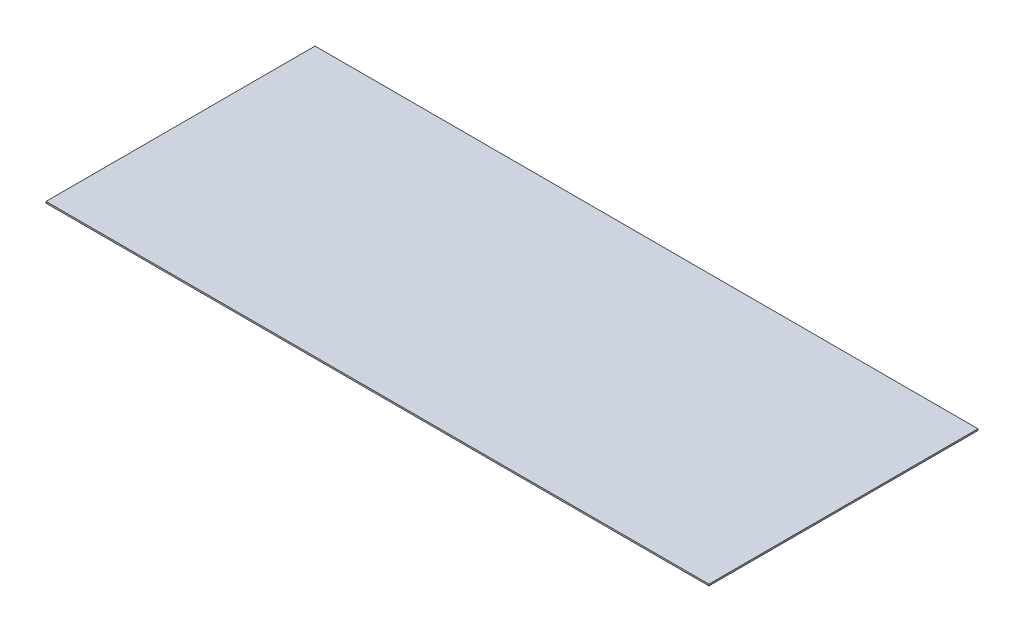
ISO-10303-21;
HEADER;
FILE_DESCRIPTION(('STEP AP214'),'2;1');
FILE_NAME('part.step','',(''),(''),'','','');
FILE_SCHEMA(('AUTOMOTIVE_DESIGN { 1 0 10303 214 1 1 1 1 }'));
ENDSEC;
DATA;
#1=APPLICATION_CONTEXT('core data for automotive mechanical design processes');
#2=APPLICATION_PROTOCOL_DEFINITION('international standard','automotive_design',2000,#1);
#3=PRODUCT_CONTEXT('',#1,'mechanical');
#4=PRODUCT('Part','Part','',(#3));
#5=PRODUCT_RELATED_PRODUCT_CATEGORY('part','',(#4));
#6=PRODUCT_DEFINITION_FORMATION('','',#4);
#7=PRODUCT_DEFINITION_CONTEXT('part definition',#1,'design');
#8=PRODUCT_DEFINITION('design','',#6,#7);
#9=PRODUCT_DEFINITION_SHAPE('','',#8);
#10=(LENGTH_UNIT() NAMED_UNIT(*) SI_UNIT(.MILLI.,.METRE.));
#11=(NAMED_UNIT(*) PLANE_ANGLE_UNIT() SI_UNIT($,.RADIAN.));
#12=(NAMED_UNIT(*) SI_UNIT($,.STERADIAN.) SOLID_ANGLE_UNIT());
#13=UNCERTAINTY_MEASURE_WITH_UNIT(LENGTH_MEASURE(1.E-05),#10,'distance_accuracy_value','');
#14=(GEOMETRIC_REPRESENTATION_CONTEXT(3) GLOBAL_UNCERTAINTY_ASSIGNED_CONTEXT((#13)) GLOBAL_UNIT_ASSIGNED_CONTEXT((#10,
#11,#12)) REPRESENTATION_CONTEXT('',''));
#15=CARTESIAN_POINT('',(0.,0.,0.));
#16=DIRECTION('',(0.,0.,1.));
#17=DIRECTION('',(1.,0.,0.));
#18=AXIS2_PLACEMENT_3D('',#15,#16,#17);
#19=CARTESIAN_POINT('',(673.354,3.175,273.304));
#20=DIRECTION('',(-1.,0.,0.));
#21=DIRECTION('',(0.,0.,1.));
#22=AXIS2_PLACEMENT_3D('',#19,#20,#21);
#23=PLANE('',#22);
#24=DIRECTION('',(0.,0.,-1.));
#25=VECTOR('',#24,1.);
#26=CARTESIAN_POINT('',(673.354,0.,273.304));
#27=LINE('',#26,#25);
#28=CARTESIAN_POINT('',(673.354,0.,273.304));
#29=VERTEX_POINT('',#28);
#30=CARTESIAN_POINT('',(673.354,0.,-273.304));
#31=VERTEX_POINT('',#30);
#32=EDGE_CURVE('E96',#29,#31,#27,.T.);
#33=ORIENTED_EDGE('',*,*,#32,.T.);
#34=DIRECTION('',(0.,-1.,0.));
#35=VECTOR('',#34,1.);
#36=CARTESIAN_POINT('',(673.354,3.175,-273.304));
#37=LINE('',#36,#35);
#38=CARTESIAN_POINT('',(673.354,3.175,-273.304));
#39=VERTEX_POINT('',#38);
#40=EDGE_CURVE('E11',#39,#31,#37,.T.);
#41=ORIENTED_EDGE('',*,*,#40,.F.);
#42=DIRECTION('',(0.,0.,-1.));
#43=VECTOR('',#42,1.);
#44=CARTESIAN_POINT('',(673.354,3.175,273.304));
#45=LINE('',#44,#43);
#46=CARTESIAN_POINT('',(673.354,3.175,273.304));
#47=VERTEX_POINT('',#46);
#48=EDGE_CURVE('E84',#47,#39,#45,.T.);
#49=ORIENTED_EDGE('',*,*,#48,.F.);
#50=DIRECTION('',(0.,-1.,0.));
#51=VECTOR('',#50,1.);
#52=CARTESIAN_POINT('',(673.354,3.175,273.304));
#53=LINE('',#52,#51);
#54=EDGE_CURVE('E92',#47,#29,#53,.T.);
#55=ORIENTED_EDGE('',*,*,#54,.T.);
#56=EDGE_LOOP('',(#33,#41,#49,#55));
#57=FACE_BOUND('',#56,.T.);
#58=ADVANCED_FACE('F33',(#57),#23,.F.);
#59=CARTESIAN_POINT('',(-673.354,3.175,-273.304));
#60=DIRECTION('',(0.,0.,1.));
#61=DIRECTION('',(1.,0.,0.));
#62=AXIS2_PLACEMENT_3D('',#59,#60,#61);
#63=PLANE('',#62);
#64=DIRECTION('',(-1.,0.,0.));
#65=VECTOR('',#64,1.);
#66=CARTESIAN_POINT('',(-673.354,0.,-273.304));
#67=LINE('',#66,#65);
#68=CARTESIAN_POINT('',(-673.354,0.,-273.304));
#69=VERTEX_POINT('',#68);
#70=EDGE_CURVE('E88',#31,#69,#67,.T.);
#71=ORIENTED_EDGE('',*,*,#70,.T.);
#72=DIRECTION('',(0.,-1.,0.));
#73=VECTOR('',#72,1.);
#74=CARTESIAN_POINT('',(-673.354,3.175,-273.304));
#75=LINE('',#74,#73);
#76=CARTESIAN_POINT('',(-673.354,3.175,-273.304));
#77=VERTEX_POINT('',#76);
#78=EDGE_CURVE('E41',#77,#69,#75,.T.);
#79=ORIENTED_EDGE('',*,*,#78,.F.);
#80=DIRECTION('',(-1.,0.,0.));
#81=VECTOR('',#80,1.);
#82=CARTESIAN_POINT('',(-673.354,3.175,-273.304));
#83=LINE('',#82,#81);
#84=EDGE_CURVE('E79',#39,#77,#83,.T.);
#85=ORIENTED_EDGE('',*,*,#84,.F.);
#86=ORIENTED_EDGE('',*,*,#40,.T.);
#87=EDGE_LOOP('',(#71,#79,#85,#86));
#88=FACE_BOUND('',#87,.T.);
#89=ADVANCED_FACE('F87',(#88),#63,.F.);
#90=CARTESIAN_POINT('',(-673.354,3.175,273.304));
#91=DIRECTION('',(1.,0.,0.));
#92=DIRECTION('',(0.,0.,-1.));
#93=AXIS2_PLACEMENT_3D('',#90,#91,#92);
#94=PLANE('',#93);
#95=DIRECTION('',(0.,0.,1.));
#96=VECTOR('',#95,1.);
#97=CARTESIAN_POINT('',(-673.354,0.,273.304));
#98=LINE('',#97,#96);
#99=CARTESIAN_POINT('',(-673.354,0.,273.304));
#100=VERTEX_POINT('',#99);
#101=EDGE_CURVE('E66',#69,#100,#98,.T.);
#102=ORIENTED_EDGE('',*,*,#101,.T.);
#103=DIRECTION('',(0.,-1.,0.));
#104=VECTOR('',#103,1.);
#105=CARTESIAN_POINT('',(-673.354,3.175,273.304));
#106=LINE('',#105,#104);
#107=CARTESIAN_POINT('',(-673.354,3.175,273.304));
#108=VERTEX_POINT('',#107);
#109=EDGE_CURVE('E89',#108,#100,#106,.T.);
#110=ORIENTED_EDGE('',*,*,#109,.F.);
#111=DIRECTION('',(0.,0.,1.));
#112=VECTOR('',#111,1.);
#113=CARTESIAN_POINT('',(-673.354,3.175,273.304));
#114=LINE('',#113,#112);
#115=EDGE_CURVE('E82',#77,#108,#114,.T.);
#116=ORIENTED_EDGE('',*,*,#115,.F.);
#117=ORIENTED_EDGE('',*,*,#78,.T.);
#118=EDGE_LOOP('',(#102,#110,#116,#117));
#119=FACE_BOUND('',#118,.T.);
#120=ADVANCED_FACE('F90',(#119),#94,.F.);
#121=CARTESIAN_POINT('',(-673.354,3.175,273.304));
#122=DIRECTION('',(0.,0.,-1.));
#123=DIRECTION('',(-1.,0.,0.));
#124=AXIS2_PLACEMENT_3D('',#121,#122,#123);
#125=PLANE('',#124);
#126=DIRECTION('',(1.,0.,0.));
#127=VECTOR('',#126,1.);
#128=CARTESIAN_POINT('',(-673.354,0.,273.304));
#129=LINE('',#128,#127);
#130=EDGE_CURVE('E72',#100,#29,#129,.T.);
#131=ORIENTED_EDGE('',*,*,#130,.T.);
#132=ORIENTED_EDGE('',*,*,#54,.F.);
#133=DIRECTION('',(1.,0.,0.));
#134=VECTOR('',#133,1.);
#135=CARTESIAN_POINT('',(-673.354,3.175,273.304));
#136=LINE('',#135,#134);
#137=EDGE_CURVE('E49',#108,#47,#136,.T.);
#138=ORIENTED_EDGE('',*,*,#137,.F.);
#139=ORIENTED_EDGE('',*,*,#109,.T.);
#140=EDGE_LOOP('',(#131,#132,#138,#139));
#141=FACE_BOUND('',#140,.T.);
#142=ADVANCED_FACE('F103',(#141),#125,.F.);
#143=CARTESIAN_POINT('',(0.,3.175,0.));
#144=DIRECTION('',(0.,-1.,0.));
#145=DIRECTION('',(0.,0.,-1.));
#146=AXIS2_PLACEMENT_3D('',#143,#144,#145);
#147=PLANE('',#146);
#148=ORIENTED_EDGE('',*,*,#48,.T.);
#149=ORIENTED_EDGE('',*,*,#84,.T.);
#150=ORIENTED_EDGE('',*,*,#115,.T.);
#151=ORIENTED_EDGE('',*,*,#137,.T.);
#152=EDGE_LOOP('',(#148,#149,#150,#151));
#153=FACE_BOUND('',#152,.T.);
#154=ADVANCED_FACE('F80',(#153),#147,.F.);
#155=CARTESIAN_POINT('',(0.,0.,0.));
#156=DIRECTION('',(0.,-1.,0.));
#157=DIRECTION('',(0.,0.,-1.));
#158=AXIS2_PLACEMENT_3D('',#155,#156,#157);
#159=PLANE('',#158);
#160=ORIENTED_EDGE('',*,*,#32,.F.);
#161=ORIENTED_EDGE('',*,*,#130,.F.);
#162=ORIENTED_EDGE('',*,*,#101,.F.);
#163=ORIENTED_EDGE('',*,*,#70,.F.);
#164=EDGE_LOOP('',(#160,#161,#162,#163));
#165=FACE_BOUND('',#164,.T.);
#166=ADVANCED_FACE('F106',(#165),#159,.T.);
#167=CLOSED_SHELL('',(#58,#89,#120,#142,#154,#166));
#168=MANIFOLD_SOLID_BREP('B2',#167);
#169=ADVANCED_BREP_SHAPE_REPRESENTATION('',(#18,#168),#14);
#170=SHAPE_DEFINITION_REPRESENTATION(#9,#169);
ENDSEC;
END-ISO-10303-21;
